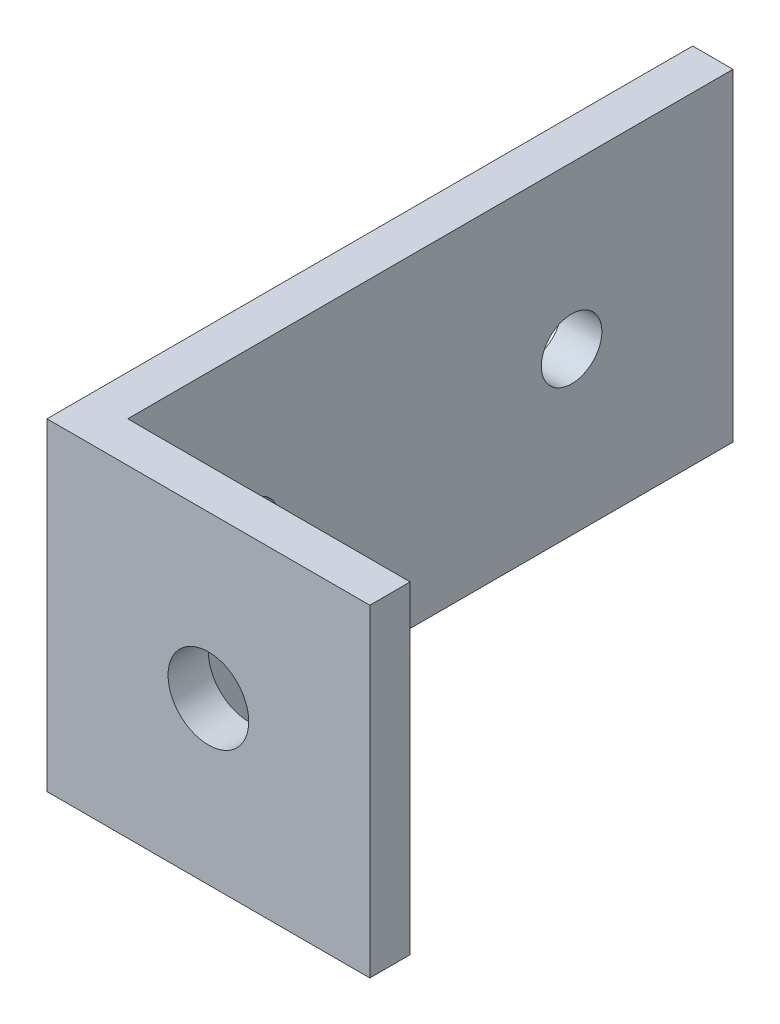
ISO-10303-21;
HEADER;
FILE_DESCRIPTION(('STEP AP214'),'2;1');
FILE_NAME('part.step','',(''),(''),'','','');
FILE_SCHEMA(('AUTOMOTIVE_DESIGN { 1 0 10303 214 1 1 1 1 }'));
ENDSEC;
DATA;
#1=APPLICATION_CONTEXT('core data for automotive mechanical design processes');
#2=APPLICATION_PROTOCOL_DEFINITION('international standard','automotive_design',2000,#1);
#3=PRODUCT_CONTEXT('',#1,'mechanical');
#4=PRODUCT('Part','Part','',(#3));
#5=PRODUCT_RELATED_PRODUCT_CATEGORY('part','',(#4));
#6=PRODUCT_DEFINITION_FORMATION('','',#4);
#7=PRODUCT_DEFINITION_CONTEXT('part definition',#1,'design');
#8=PRODUCT_DEFINITION('design','',#6,#7);
#9=PRODUCT_DEFINITION_SHAPE('','',#8);
#10=(LENGTH_UNIT() NAMED_UNIT(*) SI_UNIT(.MILLI.,.METRE.));
#11=(NAMED_UNIT(*) PLANE_ANGLE_UNIT() SI_UNIT($,.RADIAN.));
#12=(NAMED_UNIT(*) SI_UNIT($,.STERADIAN.) SOLID_ANGLE_UNIT());
#13=UNCERTAINTY_MEASURE_WITH_UNIT(LENGTH_MEASURE(1.E-05),#10,'distance_accuracy_value','');
#14=(GEOMETRIC_REPRESENTATION_CONTEXT(3) GLOBAL_UNCERTAINTY_ASSIGNED_CONTEXT((#13)) GLOBAL_UNIT_ASSIGNED_CONTEXT((#10,
#11,#12)) REPRESENTATION_CONTEXT('',''));
#15=CARTESIAN_POINT('',(0.,0.,0.));
#16=DIRECTION('',(0.,0.,1.));
#17=DIRECTION('',(1.,0.,0.));
#18=AXIS2_PLACEMENT_3D('',#15,#16,#17);
#19=CARTESIAN_POINT('',(22.225,25.4,0.));
#20=DIRECTION('',(-1.,0.,0.));
#21=DIRECTION('',(0.,0.,1.));
#22=AXIS2_PLACEMENT_3D('',#19,#20,#21);
#23=PLANE('',#22);
#24=DIRECTION('',(0.,0.,-1.));
#25=VECTOR('',#24,1.);
#26=CARTESIAN_POINT('',(22.225,0.,0.));
#27=LINE('',#26,#25);
#28=CARTESIAN_POINT('',(22.225,0.,3.175));
#29=VERTEX_POINT('',#28);
#30=CARTESIAN_POINT('',(22.225,0.,0.));
#31=VERTEX_POINT('',#30);
#32=EDGE_CURVE('E122',#29,#31,#27,.T.);
#33=ORIENTED_EDGE('',*,*,#32,.T.);
#34=DIRECTION('',(0.,-1.,0.));
#35=VECTOR('',#34,1.);
#36=CARTESIAN_POINT('',(22.225,25.4,0.));
#37=LINE('',#36,#35);
#38=CARTESIAN_POINT('',(22.225,25.4,0.));
#39=VERTEX_POINT('',#38);
#40=EDGE_CURVE('E42',#39,#31,#37,.T.);
#41=ORIENTED_EDGE('',*,*,#40,.F.);
#42=DIRECTION('',(0.,0.,-1.));
#43=VECTOR('',#42,1.);
#44=CARTESIAN_POINT('',(22.225,25.4,0.));
#45=LINE('',#44,#43);
#46=CARTESIAN_POINT('',(22.225,25.4,3.175));
#47=VERTEX_POINT('',#46);
#48=EDGE_CURVE('E88',#47,#39,#45,.T.);
#49=ORIENTED_EDGE('',*,*,#48,.F.);
#50=DIRECTION('',(0.,-1.,0.));
#51=VECTOR('',#50,1.);
#52=CARTESIAN_POINT('',(22.225,25.4,3.175));
#53=LINE('',#52,#51);
#54=EDGE_CURVE('E11',#47,#29,#53,.T.);
#55=ORIENTED_EDGE('',*,*,#54,.T.);
#56=EDGE_LOOP('',(#33,#41,#49,#55));
#57=FACE_BOUND('',#56,.T.);
#58=ADVANCED_FACE('F34',(#57),#23,.F.);
#59=CARTESIAN_POINT('',(0.,25.4,0.));
#60=DIRECTION('',(0.,0.,1.));
#61=DIRECTION('',(1.,0.,0.));
#62=AXIS2_PLACEMENT_3D('',#59,#60,#61);
#63=PLANE('',#62);
#64=CARTESIAN_POINT('',(9.525,12.7,0.));
#65=DIRECTION('',(0.,0.,-1.));
#66=DIRECTION('',(-1.,0.,0.));
#67=AXIS2_PLACEMENT_3D('',#64,#65,#66);
#68=CIRCLE('',#67,3.175);
#69=CARTESIAN_POINT('',(6.35,12.7,0.));
#70=VERTEX_POINT('',#69);
#71=EDGE_CURVE('E147',#70,#70,#68,.T.);
#72=ORIENTED_EDGE('',*,*,#71,.F.);
#73=EDGE_LOOP('',(#72));
#74=FACE_BOUND('',#73,.T.);
#75=DIRECTION('',(-1.,0.,0.));
#76=VECTOR('',#75,1.);
#77=CARTESIAN_POINT('',(0.,0.,0.));
#78=LINE('',#77,#76);
#79=CARTESIAN_POINT('',(0.,0.,0.));
#80=VERTEX_POINT('',#79);
#81=EDGE_CURVE('E124',#31,#80,#78,.T.);
#82=ORIENTED_EDGE('',*,*,#81,.T.);
#83=DIRECTION('',(0.,-1.,0.));
#84=VECTOR('',#83,1.);
#85=CARTESIAN_POINT('',(0.,25.4,0.));
#86=LINE('',#85,#84);
#87=CARTESIAN_POINT('',(0.,25.4,0.));
#88=VERTEX_POINT('',#87);
#89=EDGE_CURVE('E111',#88,#80,#86,.T.);
#90=ORIENTED_EDGE('',*,*,#89,.F.);
#91=DIRECTION('',(-1.,0.,0.));
#92=VECTOR('',#91,1.);
#93=CARTESIAN_POINT('',(0.,25.4,0.));
#94=LINE('',#93,#92);
#95=EDGE_CURVE('E102',#39,#88,#94,.T.);
#96=ORIENTED_EDGE('',*,*,#95,.F.);
#97=ORIENTED_EDGE('',*,*,#40,.T.);
#98=EDGE_LOOP('',(#82,#90,#96,#97));
#99=FACE_BOUND('',#98,.T.);
#100=ADVANCED_FACE('F137',(#74,#99),#63,.F.);
#101=CARTESIAN_POINT('',(0.,25.4,-47.625));
#102=DIRECTION('',(-1.,0.,0.));
#103=DIRECTION('',(0.,0.,1.));
#104=AXIS2_PLACEMENT_3D('',#101,#102,#103);
#105=PLANE('',#104);
#106=CARTESIAN_POINT('',(0.,12.7,-34.925));
#107=DIRECTION('',(-1.,0.,0.));
#108=DIRECTION('',(0.,0.,1.));
#109=AXIS2_PLACEMENT_3D('',#106,#107,#108);
#110=CIRCLE('',#109,2.38125);
#111=CARTESIAN_POINT('',(0.,12.7,-32.54375));
#112=VERTEX_POINT('',#111);
#113=EDGE_CURVE('E158',#112,#112,#110,.T.);
#114=ORIENTED_EDGE('',*,*,#113,.T.);
#115=EDGE_LOOP('',(#114));
#116=FACE_BOUND('',#115,.T.);
#117=CARTESIAN_POINT('',(0.,12.7,-9.525));
#118=DIRECTION('',(-1.,0.,0.));
#119=DIRECTION('',(0.,0.,1.));
#120=AXIS2_PLACEMENT_3D('',#117,#118,#119);
#121=CIRCLE('',#120,2.38125);
#122=CARTESIAN_POINT('',(0.,12.7,-7.14375));
#123=VERTEX_POINT('',#122);
#124=EDGE_CURVE('E150',#123,#123,#121,.T.);
#125=ORIENTED_EDGE('',*,*,#124,.T.);
#126=EDGE_LOOP('',(#125));
#127=FACE_BOUND('',#126,.T.);
#128=DIRECTION('',(0.,0.,-1.));
#129=VECTOR('',#128,1.);
#130=CARTESIAN_POINT('',(0.,0.,-47.625));
#131=LINE('',#130,#129);
#132=CARTESIAN_POINT('',(0.,0.,-47.625));
#133=VERTEX_POINT('',#132);
#134=EDGE_CURVE('E110',#80,#133,#131,.T.);
#135=ORIENTED_EDGE('',*,*,#134,.T.);
#136=DIRECTION('',(0.,-1.,0.));
#137=VECTOR('',#136,1.);
#138=CARTESIAN_POINT('',(0.,25.4,-47.625));
#139=LINE('',#138,#137);
#140=CARTESIAN_POINT('',(0.,25.4,-47.625));
#141=VERTEX_POINT('',#140);
#142=EDGE_CURVE('E107',#141,#133,#139,.T.);
#143=ORIENTED_EDGE('',*,*,#142,.F.);
#144=DIRECTION('',(0.,0.,-1.));
#145=VECTOR('',#144,1.);
#146=CARTESIAN_POINT('',(0.,25.4,-47.625));
#147=LINE('',#146,#145);
#148=EDGE_CURVE('E96',#88,#141,#147,.T.);
#149=ORIENTED_EDGE('',*,*,#148,.F.);
#150=ORIENTED_EDGE('',*,*,#89,.T.);
#151=EDGE_LOOP('',(#135,#143,#149,#150));
#152=FACE_BOUND('',#151,.T.);
#153=ADVANCED_FACE('F108',(#116,#127,#152),#105,.F.);
#154=CARTESIAN_POINT('',(-3.175,25.4,-47.625));
#155=DIRECTION('',(0.,0.,1.));
#156=DIRECTION('',(1.,0.,0.));
#157=AXIS2_PLACEMENT_3D('',#154,#155,#156);
#158=PLANE('',#157);
#159=DIRECTION('',(-1.,0.,0.));
#160=VECTOR('',#159,1.);
#161=CARTESIAN_POINT('',(-3.175,0.,-47.625));
#162=LINE('',#161,#160);
#163=CARTESIAN_POINT('',(-3.175,0.,-47.625));
#164=VERTEX_POINT('',#163);
#165=EDGE_CURVE('E74',#133,#164,#162,.T.);
#166=ORIENTED_EDGE('',*,*,#165,.T.);
#167=DIRECTION('',(0.,-1.,0.));
#168=VECTOR('',#167,1.);
#169=CARTESIAN_POINT('',(-3.175,25.4,-47.625));
#170=LINE('',#169,#168);
#171=CARTESIAN_POINT('',(-3.175,25.4,-47.625));
#172=VERTEX_POINT('',#171);
#173=EDGE_CURVE('E112',#172,#164,#170,.T.);
#174=ORIENTED_EDGE('',*,*,#173,.F.);
#175=DIRECTION('',(-1.,0.,0.));
#176=VECTOR('',#175,1.);
#177=CARTESIAN_POINT('',(-3.175,25.4,-47.625));
#178=LINE('',#177,#176);
#179=EDGE_CURVE('E100',#141,#172,#178,.T.);
#180=ORIENTED_EDGE('',*,*,#179,.F.);
#181=ORIENTED_EDGE('',*,*,#142,.T.);
#182=EDGE_LOOP('',(#166,#174,#180,#181));
#183=FACE_BOUND('',#182,.T.);
#184=ADVANCED_FACE('F114',(#183),#158,.F.);
#185=CARTESIAN_POINT('',(-3.175,25.4,-47.625));
#186=DIRECTION('',(1.,0.,0.));
#187=DIRECTION('',(0.,0.,-1.));
#188=AXIS2_PLACEMENT_3D('',#185,#186,#187);
#189=PLANE('',#188);
#190=CARTESIAN_POINT('',(-3.175,12.7,-34.925));
#191=DIRECTION('',(-1.,0.,0.));
#192=DIRECTION('',(0.,0.,1.));
#193=AXIS2_PLACEMENT_3D('',#190,#191,#192);
#194=CIRCLE('',#193,2.38125);
#195=CARTESIAN_POINT('',(-3.175,12.7,-32.54375));
#196=VERTEX_POINT('',#195);
#197=EDGE_CURVE('E161',#196,#196,#194,.T.);
#198=ORIENTED_EDGE('',*,*,#197,.F.);
#199=EDGE_LOOP('',(#198));
#200=FACE_BOUND('',#199,.T.);
#201=CARTESIAN_POINT('',(-3.175,12.7,-9.525));
#202=DIRECTION('',(-1.,0.,0.));
#203=DIRECTION('',(0.,0.,1.));
#204=AXIS2_PLACEMENT_3D('',#201,#202,#203);
#205=CIRCLE('',#204,2.38125);
#206=CARTESIAN_POINT('',(-3.17499999999999,12.7,-7.14375));
#207=VERTEX_POINT('',#206);
#208=EDGE_CURVE('E155',#207,#207,#205,.T.);
#209=ORIENTED_EDGE('',*,*,#208,.F.);
#210=EDGE_LOOP('',(#209));
#211=FACE_BOUND('',#210,.T.);
#212=DIRECTION('',(0.,0.,1.));
#213=VECTOR('',#212,1.);
#214=CARTESIAN_POINT('',(-3.175,0.,-47.625));
#215=LINE('',#214,#213);
#216=CARTESIAN_POINT('',(-3.17499999999999,0.,3.175));
#217=VERTEX_POINT('',#216);
#218=EDGE_CURVE('E81',#164,#217,#215,.T.);
#219=ORIENTED_EDGE('',*,*,#218,.T.);
#220=DIRECTION('',(0.,-1.,0.));
#221=VECTOR('',#220,1.);
#222=CARTESIAN_POINT('',(-3.17499999999999,25.4,3.175));
#223=LINE('',#222,#221);
#224=CARTESIAN_POINT('',(-3.17499999999999,25.4,3.175));
#225=VERTEX_POINT('',#224);
#226=EDGE_CURVE('E118',#225,#217,#223,.T.);
#227=ORIENTED_EDGE('',*,*,#226,.F.);
#228=DIRECTION('',(0.,0.,1.));
#229=VECTOR('',#228,1.);
#230=CARTESIAN_POINT('',(-3.175,25.4,-47.625));
#231=LINE('',#230,#229);
#232=EDGE_CURVE('E116',#172,#225,#231,.T.);
#233=ORIENTED_EDGE('',*,*,#232,.F.);
#234=ORIENTED_EDGE('',*,*,#173,.T.);
#235=EDGE_LOOP('',(#219,#227,#233,#234));
#236=FACE_BOUND('',#235,.T.);
#237=ADVANCED_FACE('F143',(#200,#211,#236),#189,.F.);
#238=CARTESIAN_POINT('',(-3.17499999999999,25.4,3.175));
#239=DIRECTION('',(0.,0.,-1.));
#240=DIRECTION('',(-1.,0.,0.));
#241=AXIS2_PLACEMENT_3D('',#238,#239,#240);
#242=PLANE('',#241);
#243=CARTESIAN_POINT('',(9.525,12.7,3.175));
#244=DIRECTION('',(0.,0.,-1.));
#245=DIRECTION('',(-1.,0.,0.));
#246=AXIS2_PLACEMENT_3D('',#243,#244,#245);
#247=CIRCLE('',#246,3.175);
#248=CARTESIAN_POINT('',(6.35,12.7,3.175));
#249=VERTEX_POINT('',#248);
#250=EDGE_CURVE('E125',#249,#249,#247,.T.);
#251=ORIENTED_EDGE('',*,*,#250,.T.);
#252=EDGE_LOOP('',(#251));
#253=FACE_BOUND('',#252,.T.);
#254=DIRECTION('',(1.,0.,0.));
#255=VECTOR('',#254,1.);
#256=CARTESIAN_POINT('',(-3.17499999999999,0.,3.175));
#257=LINE('',#256,#255);
#258=EDGE_CURVE('E130',#217,#29,#257,.T.);
#259=ORIENTED_EDGE('',*,*,#258,.T.);
#260=ORIENTED_EDGE('',*,*,#54,.F.);
#261=DIRECTION('',(1.,0.,0.));
#262=VECTOR('',#261,1.);
#263=CARTESIAN_POINT('',(4.25962732919255,25.4,3.175));
#264=LINE('',#263,#262);
#265=EDGE_CURVE('E50',#225,#47,#264,.T.);
#266=ORIENTED_EDGE('',*,*,#265,.F.);
#267=ORIENTED_EDGE('',*,*,#226,.T.);
#268=EDGE_LOOP('',(#259,#260,#266,#267));
#269=FACE_BOUND('',#268,.T.);
#270=ADVANCED_FACE('F142',(#253,#269),#242,.F.);
#271=CARTESIAN_POINT('',(0.,25.4,0.));
#272=DIRECTION('',(0.,-1.,0.));
#273=DIRECTION('',(0.,0.,-1.));
#274=AXIS2_PLACEMENT_3D('',#271,#272,#273);
#275=PLANE('',#274);
#276=ORIENTED_EDGE('',*,*,#265,.T.);
#277=ORIENTED_EDGE('',*,*,#48,.T.);
#278=ORIENTED_EDGE('',*,*,#95,.T.);
#279=ORIENTED_EDGE('',*,*,#148,.T.);
#280=ORIENTED_EDGE('',*,*,#179,.T.);
#281=ORIENTED_EDGE('',*,*,#232,.T.);
#282=EDGE_LOOP('',(#276,#277,#278,#279,#280,#281));
#283=FACE_BOUND('',#282,.T.);
#284=ADVANCED_FACE('F98',(#283),#275,.F.);
#285=CARTESIAN_POINT('',(0.,0.,0.));
#286=DIRECTION('',(0.,-1.,0.));
#287=DIRECTION('',(0.,0.,-1.));
#288=AXIS2_PLACEMENT_3D('',#285,#286,#287);
#289=PLANE('',#288);
#290=ORIENTED_EDGE('',*,*,#32,.F.);
#291=ORIENTED_EDGE('',*,*,#258,.F.);
#292=ORIENTED_EDGE('',*,*,#218,.F.);
#293=ORIENTED_EDGE('',*,*,#165,.F.);
#294=ORIENTED_EDGE('',*,*,#134,.F.);
#295=ORIENTED_EDGE('',*,*,#81,.F.);
#296=EDGE_LOOP('',(#290,#291,#292,#293,#294,#295));
#297=FACE_BOUND('',#296,.T.);
#298=ADVANCED_FACE('F140',(#297),#289,.T.);
#299=CARTESIAN_POINT('',(9.525,12.7,3.175));
#300=DIRECTION('',(0.,0.,-1.));
#301=DIRECTION('',(-1.,0.,0.));
#302=AXIS2_PLACEMENT_3D('',#299,#300,#301);
#303=CYLINDRICAL_SURFACE('',#302,3.175);
#304=ORIENTED_EDGE('',*,*,#250,.F.);
#305=EDGE_LOOP('',(#304));
#306=FACE_BOUND('',#305,.T.);
#307=ORIENTED_EDGE('',*,*,#71,.T.);
#308=EDGE_LOOP('',(#307));
#309=FACE_BOUND('',#308,.T.);
#310=ADVANCED_FACE('F176',(#306,#309),#303,.F.);
#311=CARTESIAN_POINT('',(22.225,12.7,-9.525));
#312=DIRECTION('',(-1.,0.,0.));
#313=DIRECTION('',(0.,0.,1.));
#314=AXIS2_PLACEMENT_3D('',#311,#312,#313);
#315=CYLINDRICAL_SURFACE('',#314,2.38125);
#316=ORIENTED_EDGE('',*,*,#208,.T.);
#317=EDGE_LOOP('',(#316));
#318=FACE_BOUND('',#317,.T.);
#319=ORIENTED_EDGE('',*,*,#124,.F.);
#320=EDGE_LOOP('',(#319));
#321=FACE_BOUND('',#320,.T.);
#322=ADVANCED_FACE('F173',(#318,#321),#315,.F.);
#323=CARTESIAN_POINT('',(22.225,12.7,-34.925));
#324=DIRECTION('',(-1.,0.,0.));
#325=DIRECTION('',(0.,0.,1.));
#326=AXIS2_PLACEMENT_3D('',#323,#324,#325);
#327=CYLINDRICAL_SURFACE('',#326,2.38125);
#328=ORIENTED_EDGE('',*,*,#197,.T.);
#329=EDGE_LOOP('',(#328));
#330=FACE_BOUND('',#329,.T.);
#331=ORIENTED_EDGE('',*,*,#113,.F.);
#332=EDGE_LOOP('',(#331));
#333=FACE_BOUND('',#332,.T.);
#334=ADVANCED_FACE('F165',(#330,#333),#327,.F.);
#335=CLOSED_SHELL('',(#58,#100,#153,#184,#237,#270,#284,#298,#310,#322,#334));
#336=MANIFOLD_SOLID_BREP('B2',#335);
#337=ADVANCED_BREP_SHAPE_REPRESENTATION('',(#18,#336),#14);
#338=SHAPE_DEFINITION_REPRESENTATION(#9,#337);
ENDSEC;
END-ISO-10303-21;
